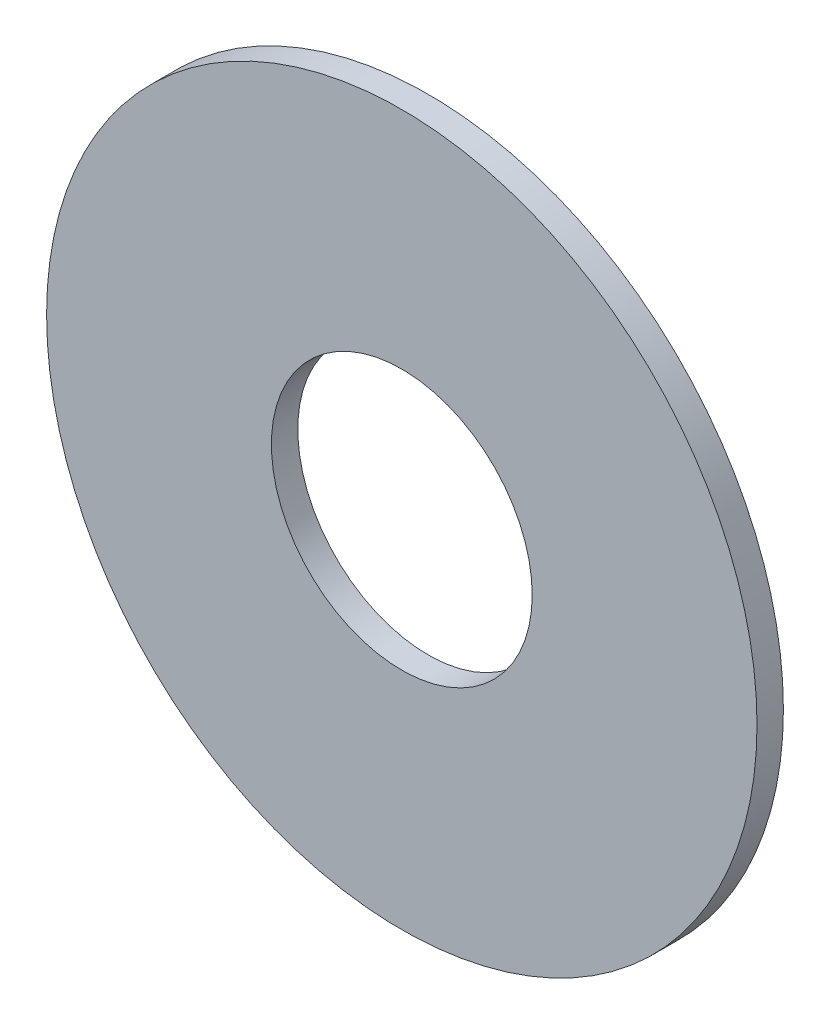
ISO-10303-21;
HEADER;
FILE_DESCRIPTION(('STEP AP214'),'2;1');
FILE_NAME('part.step','',(''),(''),'','','');
FILE_SCHEMA(('AUTOMOTIVE_DESIGN { 1 0 10303 214 1 1 1 1 }'));
ENDSEC;
DATA;
#1=APPLICATION_CONTEXT('core data for automotive mechanical design processes');
#2=APPLICATION_PROTOCOL_DEFINITION('international standard','automotive_design',2000,#1);
#3=PRODUCT_CONTEXT('',#1,'mechanical');
#4=PRODUCT('Part','Part','',(#3));
#5=PRODUCT_RELATED_PRODUCT_CATEGORY('part','',(#4));
#6=PRODUCT_DEFINITION_FORMATION('','',#4);
#7=PRODUCT_DEFINITION_CONTEXT('part definition',#1,'design');
#8=PRODUCT_DEFINITION('design','',#6,#7);
#9=PRODUCT_DEFINITION_SHAPE('','',#8);
#10=(LENGTH_UNIT() NAMED_UNIT(*) SI_UNIT(.MILLI.,.METRE.));
#11=(NAMED_UNIT(*) PLANE_ANGLE_UNIT() SI_UNIT($,.RADIAN.));
#12=(NAMED_UNIT(*) SI_UNIT($,.STERADIAN.) SOLID_ANGLE_UNIT());
#13=UNCERTAINTY_MEASURE_WITH_UNIT(LENGTH_MEASURE(1.E-05),#10,'distance_accuracy_value','');
#14=(GEOMETRIC_REPRESENTATION_CONTEXT(3) GLOBAL_UNCERTAINTY_ASSIGNED_CONTEXT((#13)) GLOBAL_UNIT_ASSIGNED_CONTEXT((#10,
#11,#12)) REPRESENTATION_CONTEXT('',''));
#15=CARTESIAN_POINT('',(0.,0.,0.));
#16=DIRECTION('',(0.,0.,1.));
#17=DIRECTION('',(1.,0.,0.));
#18=AXIS2_PLACEMENT_3D('',#15,#16,#17);
#19=CARTESIAN_POINT('',(0.,0.,0.6604));
#20=DIRECTION('',(0.,0.,1.));
#21=DIRECTION('',(1.,0.,0.));
#22=AXIS2_PLACEMENT_3D('',#19,#20,#21);
#23=PLANE('',#22);
#24=CARTESIAN_POINT('',(0.,0.,0.6604));
#25=DIRECTION('',(0.,0.,1.));
#26=DIRECTION('',(1.,0.,0.));
#27=AXIS2_PLACEMENT_3D('',#24,#25,#26);
#28=CIRCLE('',#27,8.89);
#29=CARTESIAN_POINT('',(8.89,0.,0.6604));
#30=VERTEX_POINT('',#29);
#31=EDGE_CURVE('E10',#30,#30,#28,.T.);
#32=ORIENTED_EDGE('',*,*,#31,.T.);
#33=EDGE_LOOP('',(#32));
#34=FACE_BOUND('',#33,.T.);
#35=CARTESIAN_POINT('',(0.,0.,0.6604));
#36=DIRECTION('',(0.,0.,1.));
#37=DIRECTION('',(1.,0.,0.));
#38=AXIS2_PLACEMENT_3D('',#35,#36,#37);
#39=CIRCLE('',#38,3.2639);
#40=CARTESIAN_POINT('',(3.2639,0.,0.6604));
#41=VERTEX_POINT('',#40);
#42=EDGE_CURVE('E56',#41,#41,#39,.T.);
#43=ORIENTED_EDGE('',*,*,#42,.F.);
#44=EDGE_LOOP('',(#43));
#45=FACE_BOUND('',#44,.T.);
#46=ADVANCED_FACE('F43',(#34,#45),#23,.T.);
#47=CARTESIAN_POINT('',(0.,0.,0.));
#48=DIRECTION('',(0.,0.,1.));
#49=DIRECTION('',(1.,0.,0.));
#50=AXIS2_PLACEMENT_3D('',#47,#48,#49);
#51=PLANE('',#50);
#52=CARTESIAN_POINT('',(0.,0.,0.));
#53=DIRECTION('',(0.,0.,1.));
#54=DIRECTION('',(1.,0.,0.));
#55=AXIS2_PLACEMENT_3D('',#52,#53,#54);
#56=CIRCLE('',#55,8.89);
#57=CARTESIAN_POINT('',(8.89,0.,0.));
#58=VERTEX_POINT('',#57);
#59=EDGE_CURVE('E47',#58,#58,#56,.T.);
#60=ORIENTED_EDGE('',*,*,#59,.F.);
#61=EDGE_LOOP('',(#60));
#62=FACE_BOUND('',#61,.T.);
#63=CARTESIAN_POINT('',(0.,0.,0.));
#64=DIRECTION('',(0.,0.,1.));
#65=DIRECTION('',(1.,0.,0.));
#66=AXIS2_PLACEMENT_3D('',#63,#64,#65);
#67=CIRCLE('',#66,3.2639);
#68=CARTESIAN_POINT('',(3.2639,0.,0.));
#69=VERTEX_POINT('',#68);
#70=EDGE_CURVE('E58',#69,#69,#67,.T.);
#71=ORIENTED_EDGE('',*,*,#70,.T.);
#72=EDGE_LOOP('',(#71));
#73=FACE_BOUND('',#72,.T.);
#74=ADVANCED_FACE('F70',(#62,#73),#51,.F.);
#75=CARTESIAN_POINT('',(0.,0.,0.6604));
#76=DIRECTION('',(0.,0.,-1.));
#77=DIRECTION('',(-1.,0.,0.));
#78=AXIS2_PLACEMENT_3D('',#75,#76,#77);
#79=CYLINDRICAL_SURFACE('',#78,8.89);
#80=ORIENTED_EDGE('',*,*,#31,.F.);
#81=EDGE_LOOP('',(#80));
#82=FACE_BOUND('',#81,.T.);
#83=ORIENTED_EDGE('',*,*,#59,.T.);
#84=EDGE_LOOP('',(#83));
#85=FACE_BOUND('',#84,.T.);
#86=ADVANCED_FACE('F45',(#82,#85),#79,.T.);
#87=CARTESIAN_POINT('',(0.,0.,0.6604));
#88=DIRECTION('',(0.,0.,-1.));
#89=DIRECTION('',(-1.,0.,0.));
#90=AXIS2_PLACEMENT_3D('',#87,#88,#89);
#91=CYLINDRICAL_SURFACE('',#90,3.2639);
#92=ORIENTED_EDGE('',*,*,#42,.T.);
#93=EDGE_LOOP('',(#92));
#94=FACE_BOUND('',#93,.T.);
#95=ORIENTED_EDGE('',*,*,#70,.F.);
#96=EDGE_LOOP('',(#95));
#97=FACE_BOUND('',#96,.T.);
#98=ADVANCED_FACE('F66',(#94,#97),#91,.F.);
#99=CLOSED_SHELL('',(#46,#74,#86,#98));
#100=MANIFOLD_SOLID_BREP('B2',#99);
#101=ADVANCED_BREP_SHAPE_REPRESENTATION('',(#18,#100),#14);
#102=SHAPE_DEFINITION_REPRESENTATION(#9,#101);
ENDSEC;
END-ISO-10303-21;
